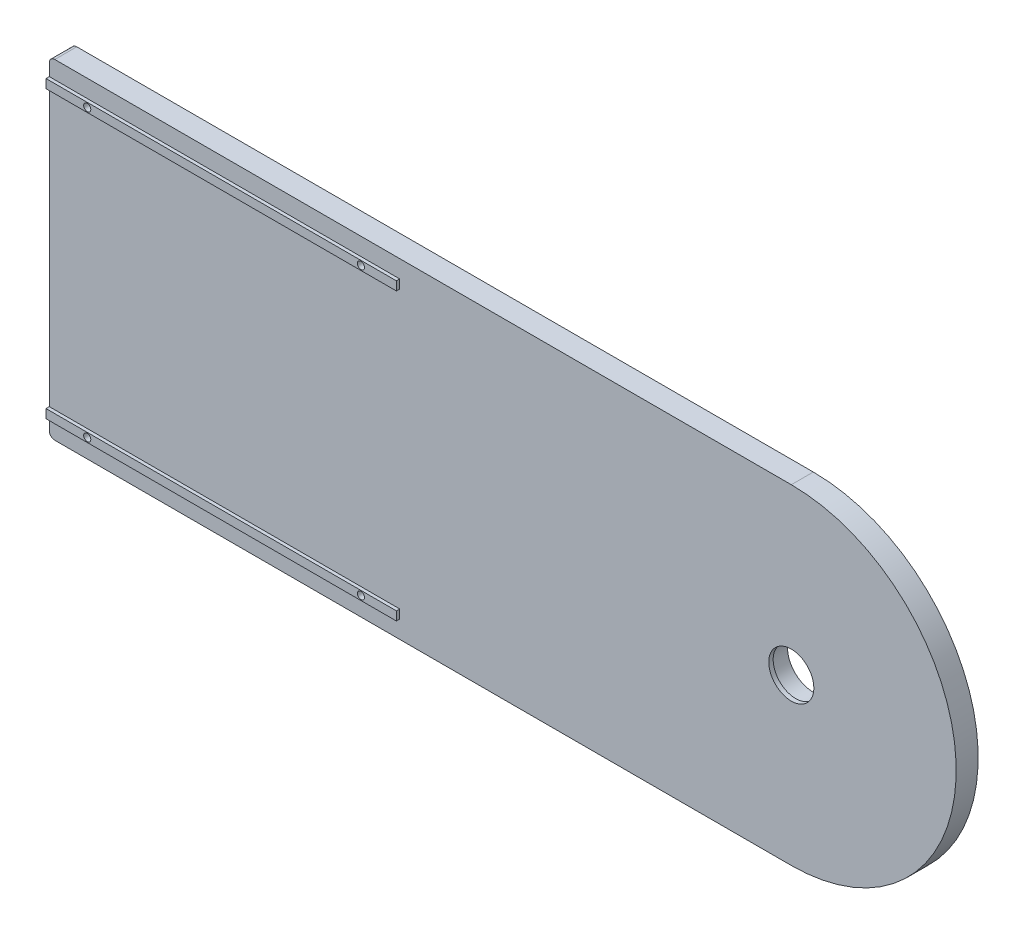
ISO-10303-21;
HEADER;
FILE_DESCRIPTION(('STEP AP214'),'2;1');
FILE_NAME('part.step','',(''),(''),'','','');
FILE_SCHEMA(('AUTOMOTIVE_DESIGN { 1 0 10303 214 1 1 1 1 }'));
ENDSEC;
DATA;
#1=APPLICATION_CONTEXT('core data for automotive mechanical design processes');
#2=APPLICATION_PROTOCOL_DEFINITION('international standard','automotive_design',2000,#1);
#3=PRODUCT_CONTEXT('',#1,'mechanical');
#4=PRODUCT('Part','Part','',(#3));
#5=PRODUCT_RELATED_PRODUCT_CATEGORY('part','',(#4));
#6=PRODUCT_DEFINITION_FORMATION('','',#4);
#7=PRODUCT_DEFINITION_CONTEXT('part definition',#1,'design');
#8=PRODUCT_DEFINITION('design','',#6,#7);
#9=PRODUCT_DEFINITION_SHAPE('','',#8);
#10=(LENGTH_UNIT() NAMED_UNIT(*) SI_UNIT(.MILLI.,.METRE.));
#11=(NAMED_UNIT(*) PLANE_ANGLE_UNIT() SI_UNIT($,.RADIAN.));
#12=(NAMED_UNIT(*) SI_UNIT($,.STERADIAN.) SOLID_ANGLE_UNIT());
#13=UNCERTAINTY_MEASURE_WITH_UNIT(LENGTH_MEASURE(1.E-05),#10,'distance_accuracy_value','');
#14=(GEOMETRIC_REPRESENTATION_CONTEXT(3) GLOBAL_UNCERTAINTY_ASSIGNED_CONTEXT((#13)) GLOBAL_UNIT_ASSIGNED_CONTEXT((#10,
#11,#12)) REPRESENTATION_CONTEXT('',''));
#15=CARTESIAN_POINT('',(0.,0.,0.));
#16=DIRECTION('',(0.,0.,1.));
#17=DIRECTION('',(1.,0.,0.));
#18=AXIS2_PLACEMENT_3D('',#15,#16,#17);
#19=CARTESIAN_POINT('',(-388.5,130.,3.));
#20=DIRECTION('',(0.,0.,-1.));
#21=DIRECTION('',(1.,0.,0.));
#22=AXIS2_PLACEMENT_3D('',#19,#20,#21);
#23=CYLINDRICAL_SURFACE('',#22,3.24999999999995);
#24=CARTESIAN_POINT('',(-388.5,130.,3.));
#25=DIRECTION('',(0.,0.,1.));
#26=DIRECTION('',(1.,0.,0.));
#27=AXIS2_PLACEMENT_3D('',#24,#25,#26);
#28=CIRCLE('',#27,3.24999999999995);
#29=CARTESIAN_POINT('',(-385.25,130.,3.));
#30=VERTEX_POINT('',#29);
#31=EDGE_CURVE('E170',#30,#30,#28,.T.);
#32=ORIENTED_EDGE('',*,*,#31,.T.);
#33=EDGE_LOOP('',(#32));
#34=FACE_BOUND('',#33,.T.);
#35=CARTESIAN_POINT('',(-388.5,130.,-15.5));
#36=DIRECTION('',(0.,0.,1.));
#37=DIRECTION('',(1.,0.,0.));
#38=AXIS2_PLACEMENT_3D('',#35,#36,#37);
#39=CIRCLE('',#38,3.24999999999995);
#40=CARTESIAN_POINT('',(-385.25,130.,-15.5));
#41=VERTEX_POINT('',#40);
#42=EDGE_CURVE('E260',#41,#41,#39,.F.);
#43=ORIENTED_EDGE('',*,*,#42,.T.);
#44=EDGE_LOOP('',(#43));
#45=FACE_BOUND('',#44,.T.);
#46=ADVANCED_FACE('F37',(#34,#45),#23,.F.);
#47=CARTESIAN_POINT('',(-637.5,130.,3.));
#48=DIRECTION('',(0.,0.,-1.));
#49=DIRECTION('',(1.,0.,0.));
#50=AXIS2_PLACEMENT_3D('',#47,#48,#49);
#51=CYLINDRICAL_SURFACE('',#50,3.24999999999995);
#52=CARTESIAN_POINT('',(-637.5,130.,3.));
#53=DIRECTION('',(0.,0.,1.));
#54=DIRECTION('',(1.,0.,0.));
#55=AXIS2_PLACEMENT_3D('',#52,#53,#54);
#56=CIRCLE('',#55,3.24999999999995);
#57=CARTESIAN_POINT('',(-634.25,130.,3.));
#58=VERTEX_POINT('',#57);
#59=EDGE_CURVE('E432',#58,#58,#56,.T.);
#60=ORIENTED_EDGE('',*,*,#59,.T.);
#61=EDGE_LOOP('',(#60));
#62=FACE_BOUND('',#61,.T.);
#63=CARTESIAN_POINT('',(-637.5,130.,-15.5));
#64=DIRECTION('',(0.,0.,1.));
#65=DIRECTION('',(1.,0.,0.));
#66=AXIS2_PLACEMENT_3D('',#63,#64,#65);
#67=CIRCLE('',#66,3.24999999999995);
#68=CARTESIAN_POINT('',(-634.25,130.,-15.5));
#69=VERTEX_POINT('',#68);
#70=EDGE_CURVE('E257',#69,#69,#67,.F.);
#71=ORIENTED_EDGE('',*,*,#70,.T.);
#72=EDGE_LOOP('',(#71));
#73=FACE_BOUND('',#72,.T.);
#74=ADVANCED_FACE('F306',(#62,#73),#51,.F.);
#75=CARTESIAN_POINT('',(-637.5,-130.,3.));
#76=DIRECTION('',(0.,0.,-1.));
#77=DIRECTION('',(1.,0.,0.));
#78=AXIS2_PLACEMENT_3D('',#75,#76,#77);
#79=CYLINDRICAL_SURFACE('',#78,3.24999999999995);
#80=CARTESIAN_POINT('',(-637.5,-130.,3.));
#81=DIRECTION('',(0.,0.,1.));
#82=DIRECTION('',(1.,0.,0.));
#83=AXIS2_PLACEMENT_3D('',#80,#81,#82);
#84=CIRCLE('',#83,3.24999999999995);
#85=CARTESIAN_POINT('',(-634.25,-130.,3.));
#86=VERTEX_POINT('',#85);
#87=EDGE_CURVE('E435',#86,#86,#84,.T.);
#88=ORIENTED_EDGE('',*,*,#87,.T.);
#89=EDGE_LOOP('',(#88));
#90=FACE_BOUND('',#89,.T.);
#91=CARTESIAN_POINT('',(-637.5,-130.,-15.5));
#92=DIRECTION('',(0.,0.,1.));
#93=DIRECTION('',(1.,0.,0.));
#94=AXIS2_PLACEMENT_3D('',#91,#92,#93);
#95=CIRCLE('',#94,3.24999999999995);
#96=CARTESIAN_POINT('',(-634.25,-130.,-15.5));
#97=VERTEX_POINT('',#96);
#98=EDGE_CURVE('E253',#97,#97,#95,.F.);
#99=ORIENTED_EDGE('',*,*,#98,.T.);
#100=EDGE_LOOP('',(#99));
#101=FACE_BOUND('',#100,.T.);
#102=ADVANCED_FACE('F312',(#90,#101),#79,.F.);
#103=CARTESIAN_POINT('',(-388.5,-130.,3.));
#104=DIRECTION('',(0.,0.,-1.));
#105=DIRECTION('',(1.,0.,0.));
#106=AXIS2_PLACEMENT_3D('',#103,#104,#105);
#107=CYLINDRICAL_SURFACE('',#106,3.24999999999995);
#108=CARTESIAN_POINT('',(-388.5,-130.,3.));
#109=DIRECTION('',(0.,0.,1.));
#110=DIRECTION('',(1.,0.,0.));
#111=AXIS2_PLACEMENT_3D('',#108,#109,#110);
#112=CIRCLE('',#111,3.24999999999995);
#113=CARTESIAN_POINT('',(-385.25,-130.,3.));
#114=VERTEX_POINT('',#113);
#115=EDGE_CURVE('E263',#114,#114,#112,.T.);
#116=ORIENTED_EDGE('',*,*,#115,.T.);
#117=EDGE_LOOP('',(#116));
#118=FACE_BOUND('',#117,.T.);
#119=CARTESIAN_POINT('',(-388.5,-130.,-15.5));
#120=DIRECTION('',(0.,0.,1.));
#121=DIRECTION('',(1.,0.,0.));
#122=AXIS2_PLACEMENT_3D('',#119,#120,#121);
#123=CIRCLE('',#122,3.24999999999995);
#124=CARTESIAN_POINT('',(-385.25,-130.,-15.5));
#125=VERTEX_POINT('',#124);
#126=EDGE_CURVE('E250',#125,#125,#123,.F.);
#127=ORIENTED_EDGE('',*,*,#126,.T.);
#128=EDGE_LOOP('',(#127));
#129=FACE_BOUND('',#128,.T.);
#130=ADVANCED_FACE('F319',(#118,#129),#107,.F.);
#131=CARTESIAN_POINT('',(0.,0.,0.));
#132=DIRECTION('',(0.,0.,-1.));
#133=DIRECTION('',(1.,0.,0.));
#134=AXIS2_PLACEMENT_3D('',#131,#132,#133);
#135=PLANE('',#134);
#136=CARTESIAN_POINT('',(0.,0.,0.));
#137=DIRECTION('',(0.,0.,1.));
#138=DIRECTION('',(1.,0.,0.));
#139=AXIS2_PLACEMENT_3D('',#136,#137,#138);
#140=CIRCLE('',#139,20.5);
#141=CARTESIAN_POINT('',(20.5,0.,0.));
#142=VERTEX_POINT('',#141);
#143=EDGE_CURVE('E217',#142,#142,#140,.T.);
#144=ORIENTED_EDGE('',*,*,#143,.F.);
#145=EDGE_LOOP('',(#144));
#146=FACE_BOUND('',#145,.T.);
#147=DIRECTION('',(0.,-1.,0.));
#148=VECTOR('',#147,1.);
#149=CARTESIAN_POINT('',(-675.,150.,0.));
#150=LINE('',#149,#148);
#151=CARTESIAN_POINT('',(-675.,145.,0.));
#152=VERTEX_POINT('',#151);
#153=CARTESIAN_POINT('',(-675.,134.,0.));
#154=VERTEX_POINT('',#153);
#155=EDGE_CURVE('E239',#152,#154,#150,.T.);
#156=ORIENTED_EDGE('',*,*,#155,.T.);
#157=DIRECTION('',(1.,0.,0.));
#158=VECTOR('',#157,1.);
#159=CARTESIAN_POINT('',(-675.,134.,0.));
#160=LINE('',#159,#158);
#161=CARTESIAN_POINT('',(-356.25,134.,0.));
#162=VERTEX_POINT('',#161);
#163=EDGE_CURVE('E153',#154,#162,#160,.T.);
#164=ORIENTED_EDGE('',*,*,#163,.T.);
#165=DIRECTION('',(0.,-1.,0.));
#166=VECTOR('',#165,1.);
#167=CARTESIAN_POINT('',(-356.25,126.,0.));
#168=LINE('',#167,#166);
#169=CARTESIAN_POINT('',(-356.25,126.,0.));
#170=VERTEX_POINT('',#169);
#171=EDGE_CURVE('E167',#162,#170,#168,.T.);
#172=ORIENTED_EDGE('',*,*,#171,.T.);
#173=DIRECTION('',(-1.,0.,0.));
#174=VECTOR('',#173,1.);
#175=CARTESIAN_POINT('',(-675.,126.,0.));
#176=LINE('',#175,#174);
#177=CARTESIAN_POINT('',(-675.,126.,0.));
#178=VERTEX_POINT('',#177);
#179=EDGE_CURVE('E164',#170,#178,#176,.T.);
#180=ORIENTED_EDGE('',*,*,#179,.T.);
#181=CARTESIAN_POINT('',(-675.,-126.,0.));
#182=VERTEX_POINT('',#181);
#183=EDGE_CURVE('E241',#178,#182,#150,.T.);
#184=ORIENTED_EDGE('',*,*,#183,.T.);
#185=DIRECTION('',(1.,0.,0.));
#186=VECTOR('',#185,1.);
#187=CARTESIAN_POINT('',(-675.,-126.,0.));
#188=LINE('',#187,#186);
#189=CARTESIAN_POINT('',(-356.25,-126.,0.));
#190=VERTEX_POINT('',#189);
#191=EDGE_CURVE('E157',#182,#190,#188,.T.);
#192=ORIENTED_EDGE('',*,*,#191,.T.);
#193=DIRECTION('',(0.,-1.,0.));
#194=VECTOR('',#193,1.);
#195=CARTESIAN_POINT('',(-356.25,-134.,0.));
#196=LINE('',#195,#194);
#197=CARTESIAN_POINT('',(-356.25,-134.,0.));
#198=VERTEX_POINT('',#197);
#199=EDGE_CURVE('E198',#190,#198,#196,.T.);
#200=ORIENTED_EDGE('',*,*,#199,.T.);
#201=DIRECTION('',(-1.,0.,0.));
#202=VECTOR('',#201,1.);
#203=CARTESIAN_POINT('',(-675.,-134.,0.));
#204=LINE('',#203,#202);
#205=CARTESIAN_POINT('',(-675.,-134.,0.));
#206=VERTEX_POINT('',#205);
#207=EDGE_CURVE('E187',#198,#206,#204,.T.);
#208=ORIENTED_EDGE('',*,*,#207,.T.);
#209=CARTESIAN_POINT('',(-675.,-145.,0.));
#210=VERTEX_POINT('',#209);
#211=EDGE_CURVE('E238',#206,#210,#150,.T.);
#212=ORIENTED_EDGE('',*,*,#211,.T.);
#213=CARTESIAN_POINT('',(-670.,-145.,0.));
#214=DIRECTION('',(0.,0.,1.));
#215=DIRECTION('',(1.,0.,0.));
#216=AXIS2_PLACEMENT_3D('',#213,#214,#215);
#217=CIRCLE('',#216,5.);
#218=CARTESIAN_POINT('',(-670.,-150.,0.));
#219=VERTEX_POINT('',#218);
#220=EDGE_CURVE('E267',#219,#210,#217,.F.);
#221=ORIENTED_EDGE('',*,*,#220,.F.);
#222=DIRECTION('',(1.,0.,0.));
#223=VECTOR('',#222,1.);
#224=CARTESIAN_POINT('',(-675.,-150.,0.));
#225=LINE('',#224,#223);
#226=CARTESIAN_POINT('',(0.,-150.,0.));
#227=VERTEX_POINT('',#226);
#228=EDGE_CURVE('E225',#219,#227,#225,.T.);
#229=ORIENTED_EDGE('',*,*,#228,.T.);
#230=CARTESIAN_POINT('',(0.,0.,0.));
#231=DIRECTION('',(0.,0.,1.));
#232=DIRECTION('',(1.,0.,0.));
#233=AXIS2_PLACEMENT_3D('',#230,#231,#232);
#234=CIRCLE('',#233,150.);
#235=CARTESIAN_POINT('',(0.,150.,0.));
#236=VERTEX_POINT('',#235);
#237=EDGE_CURVE('E220',#227,#236,#234,.T.);
#238=ORIENTED_EDGE('',*,*,#237,.T.);
#239=DIRECTION('',(-1.,0.,0.));
#240=VECTOR('',#239,1.);
#241=CARTESIAN_POINT('',(0.,150.,0.));
#242=LINE('',#241,#240);
#243=CARTESIAN_POINT('',(-670.,150.,0.));
#244=VERTEX_POINT('',#243);
#245=EDGE_CURVE('E235',#236,#244,#242,.T.);
#246=ORIENTED_EDGE('',*,*,#245,.T.);
#247=CARTESIAN_POINT('',(-670.,145.,0.));
#248=DIRECTION('',(0.,0.,1.));
#249=DIRECTION('',(1.,0.,0.));
#250=AXIS2_PLACEMENT_3D('',#247,#248,#249);
#251=CIRCLE('',#250,5.);
#252=EDGE_CURVE('E270',#152,#244,#251,.F.);
#253=ORIENTED_EDGE('',*,*,#252,.F.);
#254=EDGE_LOOP('',(#156,#164,#172,#180,#184,#192,#200,#208,#212,#221,#229,#238,#246,#253));
#255=FACE_BOUND('',#254,.T.);
#256=ADVANCED_FACE('F284',(#146,#255),#135,.F.);
#257=CARTESIAN_POINT('',(0.,0.,-20.));
#258=DIRECTION('',(0.,0.,1.));
#259=DIRECTION('',(-1.,0.,0.));
#260=AXIS2_PLACEMENT_3D('',#257,#258,#259);
#261=CYLINDRICAL_SURFACE('',#260,20.5);
#262=ORIENTED_EDGE('',*,*,#143,.T.);
#263=EDGE_LOOP('',(#262));
#264=FACE_BOUND('',#263,.T.);
#265=CARTESIAN_POINT('',(0.,0.,-4.));
#266=DIRECTION('',(0.,0.,1.));
#267=DIRECTION('',(1.,0.,0.));
#268=AXIS2_PLACEMENT_3D('',#265,#266,#267);
#269=CIRCLE('',#268,20.5);
#270=CARTESIAN_POINT('',(20.5,0.,-4.));
#271=VERTEX_POINT('',#270);
#272=EDGE_CURVE('E214',#271,#271,#269,.T.);
#273=ORIENTED_EDGE('',*,*,#272,.F.);
#274=EDGE_LOOP('',(#273));
#275=FACE_BOUND('',#274,.T.);
#276=ADVANCED_FACE('F354',(#264,#275),#261,.F.);
#277=CARTESIAN_POINT('',(0.,0.,-20.));
#278=DIRECTION('',(0.,0.,-1.));
#279=DIRECTION('',(1.,0.,0.));
#280=AXIS2_PLACEMENT_3D('',#277,#278,#279);
#281=PLANE('',#280);
#282=CARTESIAN_POINT('',(-637.5,-130.,-20.));
#283=DIRECTION('',(0.,0.,1.));
#284=DIRECTION('',(1.,0.,0.));
#285=AXIS2_PLACEMENT_3D('',#282,#283,#284);
#286=CIRCLE('',#285,5.50000000000007);
#287=CARTESIAN_POINT('',(-632.,-130.,-20.));
#288=VERTEX_POINT('',#287);
#289=EDGE_CURVE('E659',#288,#288,#286,.T.);
#290=ORIENTED_EDGE('',*,*,#289,.T.);
#291=EDGE_LOOP('',(#290));
#292=FACE_BOUND('',#291,.T.);
#293=CARTESIAN_POINT('',(-388.5,-130.,-20.));
#294=DIRECTION('',(0.,0.,1.));
#295=DIRECTION('',(1.,0.,0.));
#296=AXIS2_PLACEMENT_3D('',#293,#294,#295);
#297=CIRCLE('',#296,5.49999999999996);
#298=CARTESIAN_POINT('',(-383.,-130.,-20.));
#299=VERTEX_POINT('',#298);
#300=EDGE_CURVE('E652',#299,#299,#297,.T.);
#301=ORIENTED_EDGE('',*,*,#300,.T.);
#302=EDGE_LOOP('',(#301));
#303=FACE_BOUND('',#302,.T.);
#304=CARTESIAN_POINT('',(-388.5,130.,-20.));
#305=DIRECTION('',(0.,0.,1.));
#306=DIRECTION('',(1.,0.,0.));
#307=AXIS2_PLACEMENT_3D('',#304,#305,#306);
#308=CIRCLE('',#307,5.49999999999996);
#309=CARTESIAN_POINT('',(-383.,130.,-20.));
#310=VERTEX_POINT('',#309);
#311=EDGE_CURVE('E428',#310,#310,#308,.T.);
#312=ORIENTED_EDGE('',*,*,#311,.T.);
#313=EDGE_LOOP('',(#312));
#314=FACE_BOUND('',#313,.T.);
#315=CARTESIAN_POINT('',(-637.5,130.,-20.));
#316=DIRECTION('',(0.,0.,1.));
#317=DIRECTION('',(1.,0.,0.));
#318=AXIS2_PLACEMENT_3D('',#315,#316,#317);
#319=CIRCLE('',#318,5.50000000000007);
#320=CARTESIAN_POINT('',(-632.,130.,-20.));
#321=VERTEX_POINT('',#320);
#322=EDGE_CURVE('E422',#321,#321,#319,.T.);
#323=ORIENTED_EDGE('',*,*,#322,.T.);
#324=EDGE_LOOP('',(#323));
#325=FACE_BOUND('',#324,.T.);
#326=CARTESIAN_POINT('',(0.,0.,-20.));
#327=DIRECTION('',(0.,0.,1.));
#328=DIRECTION('',(1.,0.,0.));
#329=AXIS2_PLACEMENT_3D('',#326,#327,#328);
#330=CIRCLE('',#329,23.5);
#331=CARTESIAN_POINT('',(23.5,0.,-20.));
#332=VERTEX_POINT('',#331);
#333=EDGE_CURVE('E210',#332,#332,#330,.T.);
#334=ORIENTED_EDGE('',*,*,#333,.T.);
#335=EDGE_LOOP('',(#334));
#336=FACE_BOUND('',#335,.T.);
#337=DIRECTION('',(-1.,0.,0.));
#338=VECTOR('',#337,1.);
#339=CARTESIAN_POINT('',(0.,150.,-20.));
#340=LINE('',#339,#338);
#341=CARTESIAN_POINT('',(0.,150.,-20.));
#342=VERTEX_POINT('',#341);
#343=CARTESIAN_POINT('',(-670.,150.,-20.));
#344=VERTEX_POINT('',#343);
#345=EDGE_CURVE('E224',#342,#344,#340,.T.);
#346=ORIENTED_EDGE('',*,*,#345,.F.);
#347=CARTESIAN_POINT('',(0.,0.,-20.));
#348=DIRECTION('',(0.,0.,1.));
#349=DIRECTION('',(1.,0.,0.));
#350=AXIS2_PLACEMENT_3D('',#347,#348,#349);
#351=CIRCLE('',#350,150.);
#352=CARTESIAN_POINT('',(0.,-150.,-20.));
#353=VERTEX_POINT('',#352);
#354=EDGE_CURVE('E221',#353,#342,#351,.T.);
#355=ORIENTED_EDGE('',*,*,#354,.F.);
#356=DIRECTION('',(1.,0.,0.));
#357=VECTOR('',#356,1.);
#358=CARTESIAN_POINT('',(-675.,-150.,-20.));
#359=LINE('',#358,#357);
#360=CARTESIAN_POINT('',(-670.,-150.,-20.));
#361=VERTEX_POINT('',#360);
#362=EDGE_CURVE('E230',#361,#353,#359,.T.);
#363=ORIENTED_EDGE('',*,*,#362,.F.);
#364=CARTESIAN_POINT('',(-670.,-145.,-20.));
#365=DIRECTION('',(0.,0.,1.));
#366=DIRECTION('',(1.,0.,0.));
#367=AXIS2_PLACEMENT_3D('',#364,#365,#366);
#368=CIRCLE('',#367,5.);
#369=CARTESIAN_POINT('',(-675.,-145.,-20.));
#370=VERTEX_POINT('',#369);
#371=EDGE_CURVE('E273',#370,#361,#368,.T.);
#372=ORIENTED_EDGE('',*,*,#371,.F.);
#373=DIRECTION('',(0.,-1.,0.));
#374=VECTOR('',#373,1.);
#375=CARTESIAN_POINT('',(-675.,150.,-20.));
#376=LINE('',#375,#374);
#377=CARTESIAN_POINT('',(-675.,145.,-20.));
#378=VERTEX_POINT('',#377);
#379=EDGE_CURVE('E228',#378,#370,#376,.T.);
#380=ORIENTED_EDGE('',*,*,#379,.F.);
#381=CARTESIAN_POINT('',(-670.,145.,-20.));
#382=DIRECTION('',(0.,0.,1.));
#383=DIRECTION('',(1.,0.,0.));
#384=AXIS2_PLACEMENT_3D('',#381,#382,#383);
#385=CIRCLE('',#384,5.);
#386=EDGE_CURVE('E45',#344,#378,#385,.T.);
#387=ORIENTED_EDGE('',*,*,#386,.F.);
#388=EDGE_LOOP('',(#346,#355,#363,#372,#380,#387));
#389=FACE_BOUND('',#388,.T.);
#390=ADVANCED_FACE('F280',(#292,#303,#314,#325,#336,#389),#281,.T.);
#391=CARTESIAN_POINT('',(0.,0.,-20.));
#392=DIRECTION('',(0.,0.,1.));
#393=DIRECTION('',(-1.,0.,0.));
#394=AXIS2_PLACEMENT_3D('',#391,#392,#393);
#395=CYLINDRICAL_SURFACE('',#394,150.);
#396=ORIENTED_EDGE('',*,*,#237,.F.);
#397=DIRECTION('',(0.,0.,1.));
#398=VECTOR('',#397,1.);
#399=CARTESIAN_POINT('',(0.,-150.,-20.));
#400=LINE('',#399,#398);
#401=EDGE_CURVE('E232',#353,#227,#400,.T.);
#402=ORIENTED_EDGE('',*,*,#401,.F.);
#403=ORIENTED_EDGE('',*,*,#354,.T.);
#404=DIRECTION('',(0.,0.,1.));
#405=VECTOR('',#404,1.);
#406=CARTESIAN_POINT('',(0.,150.,-20.));
#407=LINE('',#406,#405);
#408=EDGE_CURVE('E245',#342,#236,#407,.T.);
#409=ORIENTED_EDGE('',*,*,#408,.T.);
#410=EDGE_LOOP('',(#396,#402,#403,#409));
#411=FACE_BOUND('',#410,.T.);
#412=ADVANCED_FACE('F291',(#411),#395,.T.);
#413=CARTESIAN_POINT('',(0.,150.,-20.));
#414=DIRECTION('',(0.,-1.,0.));
#415=DIRECTION('',(0.,0.,1.));
#416=AXIS2_PLACEMENT_3D('',#413,#414,#415);
#417=PLANE('',#416);
#418=ORIENTED_EDGE('',*,*,#245,.F.);
#419=ORIENTED_EDGE('',*,*,#408,.F.);
#420=ORIENTED_EDGE('',*,*,#345,.T.);
#421=DIRECTION('',(0.,0.,1.));
#422=VECTOR('',#421,1.);
#423=CARTESIAN_POINT('',(-670.,150.,-20.));
#424=LINE('',#423,#422);
#425=EDGE_CURVE('E58',#244,#344,#424,.F.);
#426=ORIENTED_EDGE('',*,*,#425,.F.);
#427=EDGE_LOOP('',(#418,#419,#420,#426));
#428=FACE_BOUND('',#427,.T.);
#429=ADVANCED_FACE('F288',(#428),#417,.F.);
#430=CARTESIAN_POINT('',(-675.,150.,-20.));
#431=DIRECTION('',(1.,0.,0.));
#432=DIRECTION('',(0.,0.,1.));
#433=AXIS2_PLACEMENT_3D('',#430,#431,#432);
#434=PLANE('',#433);
#435=ORIENTED_EDGE('',*,*,#379,.T.);
#436=DIRECTION('',(0.,0.,1.));
#437=VECTOR('',#436,1.);
#438=CARTESIAN_POINT('',(-675.,-145.,-20.));
#439=LINE('',#438,#437);
#440=EDGE_CURVE('E247',#210,#370,#439,.F.);
#441=ORIENTED_EDGE('',*,*,#440,.F.);
#442=ORIENTED_EDGE('',*,*,#211,.F.);
#443=DIRECTION('',(0.,0.,-1.));
#444=VECTOR('',#443,1.);
#445=CARTESIAN_POINT('',(-675.,-134.,3.));
#446=LINE('',#445,#444);
#447=CARTESIAN_POINT('',(-675.,-134.,3.));
#448=VERTEX_POINT('',#447);
#449=EDGE_CURVE('E195',#448,#206,#446,.T.);
#450=ORIENTED_EDGE('',*,*,#449,.F.);
#451=DIRECTION('',(0.,1.,0.));
#452=VECTOR('',#451,1.);
#453=CARTESIAN_POINT('',(-675.,-134.,3.));
#454=LINE('',#453,#452);
#455=CARTESIAN_POINT('',(-675.,-126.,3.));
#456=VERTEX_POINT('',#455);
#457=EDGE_CURVE('E183',#448,#456,#454,.T.);
#458=ORIENTED_EDGE('',*,*,#457,.T.);
#459=DIRECTION('',(0.,0.,-1.));
#460=VECTOR('',#459,1.);
#461=CARTESIAN_POINT('',(-675.,-126.,3.));
#462=LINE('',#461,#460);
#463=EDGE_CURVE('E208',#456,#182,#462,.T.);
#464=ORIENTED_EDGE('',*,*,#463,.T.);
#465=ORIENTED_EDGE('',*,*,#183,.F.);
#466=DIRECTION('',(0.,0.,-1.));
#467=VECTOR('',#466,1.);
#468=CARTESIAN_POINT('',(-675.,126.,3.));
#469=LINE('',#468,#467);
#470=CARTESIAN_POINT('',(-675.,126.,3.));
#471=VERTEX_POINT('',#470);
#472=EDGE_CURVE('E163',#471,#178,#469,.T.);
#473=ORIENTED_EDGE('',*,*,#472,.F.);
#474=DIRECTION('',(0.,1.,0.));
#475=VECTOR('',#474,1.);
#476=CARTESIAN_POINT('',(-675.,126.,3.));
#477=LINE('',#476,#475);
#478=CARTESIAN_POINT('',(-675.,134.,3.));
#479=VERTEX_POINT('',#478);
#480=EDGE_CURVE('E142',#471,#479,#477,.T.);
#481=ORIENTED_EDGE('',*,*,#480,.T.);
#482=DIRECTION('',(0.,0.,-1.));
#483=VECTOR('',#482,1.);
#484=CARTESIAN_POINT('',(-675.,134.,3.));
#485=LINE('',#484,#483);
#486=EDGE_CURVE('E150',#479,#154,#485,.T.);
#487=ORIENTED_EDGE('',*,*,#486,.T.);
#488=ORIENTED_EDGE('',*,*,#155,.F.);
#489=DIRECTION('',(0.,0.,1.));
#490=VECTOR('',#489,1.);
#491=CARTESIAN_POINT('',(-675.,145.,-20.));
#492=LINE('',#491,#490);
#493=EDGE_CURVE('E265',#378,#152,#492,.T.);
#494=ORIENTED_EDGE('',*,*,#493,.F.);
#495=EDGE_LOOP('',(#435,#441,#442,#450,#458,#464,#465,#473,#481,#487,#488,#494));
#496=FACE_BOUND('',#495,.T.);
#497=ADVANCED_FACE('F161',(#496),#434,.F.);
#498=CARTESIAN_POINT('',(-675.,-150.,-20.));
#499=DIRECTION('',(0.,1.,0.));
#500=DIRECTION('',(0.,0.,-1.));
#501=AXIS2_PLACEMENT_3D('',#498,#499,#500);
#502=PLANE('',#501);
#503=ORIENTED_EDGE('',*,*,#362,.T.);
#504=ORIENTED_EDGE('',*,*,#401,.T.);
#505=ORIENTED_EDGE('',*,*,#228,.F.);
#506=DIRECTION('',(0.,0.,1.));
#507=VECTOR('',#506,1.);
#508=CARTESIAN_POINT('',(-670.,-150.,-20.));
#509=LINE('',#508,#507);
#510=EDGE_CURVE('E11',#361,#219,#509,.T.);
#511=ORIENTED_EDGE('',*,*,#510,.F.);
#512=EDGE_LOOP('',(#503,#504,#505,#511));
#513=FACE_BOUND('',#512,.T.);
#514=ADVANCED_FACE('F292',(#513),#502,.F.);
#515=CARTESIAN_POINT('',(0.,0.,-4.));
#516=DIRECTION('',(0.,0.,-1.));
#517=DIRECTION('',(1.,0.,0.));
#518=AXIS2_PLACEMENT_3D('',#515,#516,#517);
#519=CYLINDRICAL_SURFACE('',#518,23.5);
#520=CARTESIAN_POINT('',(0.,0.,-4.));
#521=DIRECTION('',(0.,0.,1.));
#522=DIRECTION('',(1.,0.,0.));
#523=AXIS2_PLACEMENT_3D('',#520,#521,#522);
#524=CIRCLE('',#523,23.5);
#525=CARTESIAN_POINT('',(23.5,0.,-4.));
#526=VERTEX_POINT('',#525);
#527=EDGE_CURVE('E211',#526,#526,#524,.T.);
#528=ORIENTED_EDGE('',*,*,#527,.T.);
#529=EDGE_LOOP('',(#528));
#530=FACE_BOUND('',#529,.T.);
#531=ORIENTED_EDGE('',*,*,#333,.F.);
#532=EDGE_LOOP('',(#531));
#533=FACE_BOUND('',#532,.T.);
#534=ADVANCED_FACE('F294',(#530,#533),#519,.F.);
#535=CARTESIAN_POINT('',(0.,0.,-4.));
#536=DIRECTION('',(0.,0.,-1.));
#537=DIRECTION('',(1.,0.,0.));
#538=AXIS2_PLACEMENT_3D('',#535,#536,#537);
#539=PLANE('',#538);
#540=ORIENTED_EDGE('',*,*,#272,.T.);
#541=EDGE_LOOP('',(#540));
#542=FACE_BOUND('',#541,.T.);
#543=ORIENTED_EDGE('',*,*,#527,.F.);
#544=EDGE_LOOP('',(#543));
#545=FACE_BOUND('',#544,.T.);
#546=ADVANCED_FACE('F300',(#542,#545),#539,.T.);
#547=CARTESIAN_POINT('',(-675.,-126.,3.));
#548=DIRECTION('',(0.,-1.,0.));
#549=DIRECTION('',(0.,0.,1.));
#550=AXIS2_PLACEMENT_3D('',#547,#548,#549);
#551=PLANE('',#550);
#552=ORIENTED_EDGE('',*,*,#191,.F.);
#553=ORIENTED_EDGE('',*,*,#463,.F.);
#554=DIRECTION('',(1.,0.,0.));
#555=VECTOR('',#554,1.);
#556=CARTESIAN_POINT('',(-675.,-126.,3.));
#557=LINE('',#556,#555);
#558=CARTESIAN_POINT('',(-356.25,-126.,3.));
#559=VERTEX_POINT('',#558);
#560=EDGE_CURVE('E186',#456,#559,#557,.T.);
#561=ORIENTED_EDGE('',*,*,#560,.T.);
#562=DIRECTION('',(0.,0.,-1.));
#563=VECTOR('',#562,1.);
#564=CARTESIAN_POINT('',(-356.25,-126.,3.));
#565=LINE('',#564,#563);
#566=EDGE_CURVE('E206',#559,#190,#565,.T.);
#567=ORIENTED_EDGE('',*,*,#566,.T.);
#568=EDGE_LOOP('',(#552,#553,#561,#567));
#569=FACE_BOUND('',#568,.T.);
#570=ADVANCED_FACE('F346',(#569),#551,.F.);
#571=CARTESIAN_POINT('',(-356.25,-134.,3.));
#572=DIRECTION('',(-1.,0.,0.));
#573=DIRECTION('',(0.,0.,-1.));
#574=AXIS2_PLACEMENT_3D('',#571,#572,#573);
#575=PLANE('',#574);
#576=ORIENTED_EDGE('',*,*,#199,.F.);
#577=ORIENTED_EDGE('',*,*,#566,.F.);
#578=DIRECTION('',(0.,-1.,0.));
#579=VECTOR('',#578,1.);
#580=CARTESIAN_POINT('',(-356.25,-134.,3.));
#581=LINE('',#580,#579);
#582=CARTESIAN_POINT('',(-356.25,-134.,3.));
#583=VERTEX_POINT('',#582);
#584=EDGE_CURVE('E190',#559,#583,#581,.T.);
#585=ORIENTED_EDGE('',*,*,#584,.T.);
#586=DIRECTION('',(0.,0.,-1.));
#587=VECTOR('',#586,1.);
#588=CARTESIAN_POINT('',(-356.25,-134.,3.));
#589=LINE('',#588,#587);
#590=EDGE_CURVE('E204',#583,#198,#589,.T.);
#591=ORIENTED_EDGE('',*,*,#590,.T.);
#592=EDGE_LOOP('',(#576,#577,#585,#591));
#593=FACE_BOUND('',#592,.T.);
#594=ADVANCED_FACE('F342',(#593),#575,.F.);
#595=CARTESIAN_POINT('',(-675.,-134.,3.));
#596=DIRECTION('',(0.,1.,0.));
#597=DIRECTION('',(-1.,0.,0.));
#598=AXIS2_PLACEMENT_3D('',#595,#596,#597);
#599=PLANE('',#598);
#600=ORIENTED_EDGE('',*,*,#207,.F.);
#601=ORIENTED_EDGE('',*,*,#590,.F.);
#602=DIRECTION('',(-1.,0.,0.));
#603=VECTOR('',#602,1.);
#604=CARTESIAN_POINT('',(-675.,-134.,3.));
#605=LINE('',#604,#603);
#606=EDGE_CURVE('E193',#583,#448,#605,.T.);
#607=ORIENTED_EDGE('',*,*,#606,.T.);
#608=ORIENTED_EDGE('',*,*,#449,.T.);
#609=EDGE_LOOP('',(#600,#601,#607,#608));
#610=FACE_BOUND('',#609,.T.);
#611=ADVANCED_FACE('F338',(#610),#599,.F.);
#612=CARTESIAN_POINT('',(0.,0.,3.));
#613=DIRECTION('',(0.,0.,1.));
#614=DIRECTION('',(-1.,0.,0.));
#615=AXIS2_PLACEMENT_3D('',#612,#613,#614);
#616=PLANE('',#615);
#617=ORIENTED_EDGE('',*,*,#115,.F.);
#618=EDGE_LOOP('',(#617));
#619=FACE_BOUND('',#618,.T.);
#620=ORIENTED_EDGE('',*,*,#87,.F.);
#621=EDGE_LOOP('',(#620));
#622=FACE_BOUND('',#621,.T.);
#623=ORIENTED_EDGE('',*,*,#457,.F.);
#624=ORIENTED_EDGE('',*,*,#606,.F.);
#625=ORIENTED_EDGE('',*,*,#584,.F.);
#626=ORIENTED_EDGE('',*,*,#560,.F.);
#627=EDGE_LOOP('',(#623,#624,#625,#626));
#628=FACE_BOUND('',#627,.T.);
#629=ADVANCED_FACE('F335',(#619,#622,#628),#616,.T.);
#630=CARTESIAN_POINT('',(-675.,134.,3.));
#631=DIRECTION('',(0.,-1.,0.));
#632=DIRECTION('',(1.,0.,0.));
#633=AXIS2_PLACEMENT_3D('',#630,#631,#632);
#634=PLANE('',#633);
#635=ORIENTED_EDGE('',*,*,#163,.F.);
#636=ORIENTED_EDGE('',*,*,#486,.F.);
#637=DIRECTION('',(1.,0.,0.));
#638=VECTOR('',#637,1.);
#639=CARTESIAN_POINT('',(-675.,134.,3.));
#640=LINE('',#639,#638);
#641=CARTESIAN_POINT('',(-356.25,134.,3.));
#642=VERTEX_POINT('',#641);
#643=EDGE_CURVE('E138',#479,#642,#640,.T.);
#644=ORIENTED_EDGE('',*,*,#643,.T.);
#645=DIRECTION('',(0.,0.,-1.));
#646=VECTOR('',#645,1.);
#647=CARTESIAN_POINT('',(-356.25,134.,3.));
#648=LINE('',#647,#646);
#649=EDGE_CURVE('E158',#642,#162,#648,.T.);
#650=ORIENTED_EDGE('',*,*,#649,.T.);
#651=EDGE_LOOP('',(#635,#636,#644,#650));
#652=FACE_BOUND('',#651,.T.);
#653=ADVANCED_FACE('F151',(#652),#634,.F.);
#654=CARTESIAN_POINT('',(-356.25,126.,3.));
#655=DIRECTION('',(-1.,0.,0.));
#656=DIRECTION('',(0.,0.,-1.));
#657=AXIS2_PLACEMENT_3D('',#654,#655,#656);
#658=PLANE('',#657);
#659=ORIENTED_EDGE('',*,*,#171,.F.);
#660=ORIENTED_EDGE('',*,*,#649,.F.);
#661=DIRECTION('',(0.,-1.,0.));
#662=VECTOR('',#661,1.);
#663=CARTESIAN_POINT('',(-356.25,126.,3.));
#664=LINE('',#663,#662);
#665=CARTESIAN_POINT('',(-356.25,126.,3.));
#666=VERTEX_POINT('',#665);
#667=EDGE_CURVE('E145',#642,#666,#664,.T.);
#668=ORIENTED_EDGE('',*,*,#667,.T.);
#669=DIRECTION('',(0.,0.,-1.));
#670=VECTOR('',#669,1.);
#671=CARTESIAN_POINT('',(-356.25,126.,3.));
#672=LINE('',#671,#670);
#673=EDGE_CURVE('E180',#666,#170,#672,.T.);
#674=ORIENTED_EDGE('',*,*,#673,.T.);
#675=EDGE_LOOP('',(#659,#660,#668,#674));
#676=FACE_BOUND('',#675,.T.);
#677=ADVANCED_FACE('F328',(#676),#658,.F.);
#678=CARTESIAN_POINT('',(-675.,126.,3.));
#679=DIRECTION('',(0.,1.,0.));
#680=DIRECTION('',(-1.,0.,0.));
#681=AXIS2_PLACEMENT_3D('',#678,#679,#680);
#682=PLANE('',#681);
#683=ORIENTED_EDGE('',*,*,#179,.F.);
#684=ORIENTED_EDGE('',*,*,#673,.F.);
#685=DIRECTION('',(-1.,0.,0.));
#686=VECTOR('',#685,1.);
#687=CARTESIAN_POINT('',(-675.,126.,3.));
#688=LINE('',#687,#686);
#689=EDGE_CURVE('E174',#666,#471,#688,.T.);
#690=ORIENTED_EDGE('',*,*,#689,.T.);
#691=ORIENTED_EDGE('',*,*,#472,.T.);
#692=EDGE_LOOP('',(#683,#684,#690,#691));
#693=FACE_BOUND('',#692,.T.);
#694=ADVANCED_FACE('F324',(#693),#682,.F.);
#695=CARTESIAN_POINT('',(0.,0.,3.));
#696=DIRECTION('',(0.,0.,1.));
#697=DIRECTION('',(-1.,0.,0.));
#698=AXIS2_PLACEMENT_3D('',#695,#696,#697);
#699=PLANE('',#698);
#700=ORIENTED_EDGE('',*,*,#59,.F.);
#701=EDGE_LOOP('',(#700));
#702=FACE_BOUND('',#701,.T.);
#703=ORIENTED_EDGE('',*,*,#31,.F.);
#704=EDGE_LOOP('',(#703));
#705=FACE_BOUND('',#704,.T.);
#706=ORIENTED_EDGE('',*,*,#480,.F.);
#707=ORIENTED_EDGE('',*,*,#689,.F.);
#708=ORIENTED_EDGE('',*,*,#667,.F.);
#709=ORIENTED_EDGE('',*,*,#643,.F.);
#710=EDGE_LOOP('',(#706,#707,#708,#709));
#711=FACE_BOUND('',#710,.T.);
#712=ADVANCED_FACE('F140',(#702,#705,#711),#699,.T.);
#713=CARTESIAN_POINT('',(-388.5,-130.,-15.5));
#714=DIRECTION('',(0.,0.,-1.));
#715=DIRECTION('',(1.,0.,0.));
#716=AXIS2_PLACEMENT_3D('',#713,#714,#715);
#717=PLANE('',#716);
#718=CARTESIAN_POINT('',(-388.5,-130.,-15.5));
#719=DIRECTION('',(0.,0.,1.));
#720=DIRECTION('',(1.,0.,0.));
#721=AXIS2_PLACEMENT_3D('',#718,#719,#720);
#722=CIRCLE('',#721,5.49999999999996);
#723=CARTESIAN_POINT('',(-383.,-130.,-15.5));
#724=VERTEX_POINT('',#723);
#725=EDGE_CURVE('E649',#724,#724,#722,.T.);
#726=ORIENTED_EDGE('',*,*,#725,.F.);
#727=EDGE_LOOP('',(#726));
#728=FACE_BOUND('',#727,.T.);
#729=ORIENTED_EDGE('',*,*,#126,.F.);
#730=EDGE_LOOP('',(#729));
#731=FACE_BOUND('',#730,.T.);
#732=ADVANCED_FACE('F323',(#728,#731),#717,.T.);
#733=CARTESIAN_POINT('',(-388.5,-130.,-15.5));
#734=DIRECTION('',(0.,0.,-1.));
#735=DIRECTION('',(1.,0.,0.));
#736=AXIS2_PLACEMENT_3D('',#733,#734,#735);
#737=CYLINDRICAL_SURFACE('',#736,5.49999999999996);
#738=ORIENTED_EDGE('',*,*,#725,.T.);
#739=EDGE_LOOP('',(#738));
#740=FACE_BOUND('',#739,.T.);
#741=ORIENTED_EDGE('',*,*,#300,.F.);
#742=EDGE_LOOP('',(#741));
#743=FACE_BOUND('',#742,.T.);
#744=ADVANCED_FACE('F384',(#740,#743),#737,.F.);
#745=CARTESIAN_POINT('',(-637.5,-130.,-15.5));
#746=DIRECTION('',(0.,0.,-1.));
#747=DIRECTION('',(1.,0.,0.));
#748=AXIS2_PLACEMENT_3D('',#745,#746,#747);
#749=PLANE('',#748);
#750=CARTESIAN_POINT('',(-637.5,-130.,-15.5));
#751=DIRECTION('',(0.,0.,1.));
#752=DIRECTION('',(1.,0.,0.));
#753=AXIS2_PLACEMENT_3D('',#750,#751,#752);
#754=CIRCLE('',#753,5.50000000000007);
#755=CARTESIAN_POINT('',(-632.,-130.,-15.5));
#756=VERTEX_POINT('',#755);
#757=EDGE_CURVE('E657',#756,#756,#754,.T.);
#758=ORIENTED_EDGE('',*,*,#757,.F.);
#759=EDGE_LOOP('',(#758));
#760=FACE_BOUND('',#759,.T.);
#761=ORIENTED_EDGE('',*,*,#98,.F.);
#762=EDGE_LOOP('',(#761));
#763=FACE_BOUND('',#762,.T.);
#764=ADVANCED_FACE('F390',(#760,#763),#749,.T.);
#765=CARTESIAN_POINT('',(-637.5,-130.,-15.5));
#766=DIRECTION('',(0.,0.,-1.));
#767=DIRECTION('',(1.,0.,0.));
#768=AXIS2_PLACEMENT_3D('',#765,#766,#767);
#769=CYLINDRICAL_SURFACE('',#768,5.50000000000007);
#770=ORIENTED_EDGE('',*,*,#757,.T.);
#771=EDGE_LOOP('',(#770));
#772=FACE_BOUND('',#771,.T.);
#773=ORIENTED_EDGE('',*,*,#289,.F.);
#774=EDGE_LOOP('',(#773));
#775=FACE_BOUND('',#774,.T.);
#776=ADVANCED_FACE('F400',(#772,#775),#769,.F.);
#777=CARTESIAN_POINT('',(-637.5,130.,-15.5));
#778=DIRECTION('',(0.,0.,-1.));
#779=DIRECTION('',(1.,0.,0.));
#780=AXIS2_PLACEMENT_3D('',#777,#778,#779);
#781=PLANE('',#780);
#782=CARTESIAN_POINT('',(-637.5,130.,-15.5));
#783=DIRECTION('',(0.,0.,1.));
#784=DIRECTION('',(1.,0.,0.));
#785=AXIS2_PLACEMENT_3D('',#782,#783,#784);
#786=CIRCLE('',#785,5.50000000000007);
#787=CARTESIAN_POINT('',(-632.,130.,-15.5));
#788=VERTEX_POINT('',#787);
#789=EDGE_CURVE('E254',#788,#788,#786,.T.);
#790=ORIENTED_EDGE('',*,*,#789,.F.);
#791=EDGE_LOOP('',(#790));
#792=FACE_BOUND('',#791,.T.);
#793=ORIENTED_EDGE('',*,*,#70,.F.);
#794=EDGE_LOOP('',(#793));
#795=FACE_BOUND('',#794,.T.);
#796=ADVANCED_FACE('F404',(#792,#795),#781,.T.);
#797=CARTESIAN_POINT('',(-637.5,130.,-15.5));
#798=DIRECTION('',(0.,0.,-1.));
#799=DIRECTION('',(1.,0.,0.));
#800=AXIS2_PLACEMENT_3D('',#797,#798,#799);
#801=CYLINDRICAL_SURFACE('',#800,5.50000000000007);
#802=ORIENTED_EDGE('',*,*,#789,.T.);
#803=EDGE_LOOP('',(#802));
#804=FACE_BOUND('',#803,.T.);
#805=ORIENTED_EDGE('',*,*,#322,.F.);
#806=EDGE_LOOP('',(#805));
#807=FACE_BOUND('',#806,.T.);
#808=ADVANCED_FACE('F408',(#804,#807),#801,.F.);
#809=CARTESIAN_POINT('',(-388.5,130.,-15.5));
#810=DIRECTION('',(0.,0.,-1.));
#811=DIRECTION('',(1.,0.,0.));
#812=AXIS2_PLACEMENT_3D('',#809,#810,#811);
#813=PLANE('',#812);
#814=CARTESIAN_POINT('',(-388.5,130.,-15.5));
#815=DIRECTION('',(0.,0.,1.));
#816=DIRECTION('',(1.,0.,0.));
#817=AXIS2_PLACEMENT_3D('',#814,#815,#816);
#818=CIRCLE('',#817,5.49999999999996);
#819=CARTESIAN_POINT('',(-383.,130.,-15.5));
#820=VERTEX_POINT('',#819);
#821=EDGE_CURVE('E424',#820,#820,#818,.T.);
#822=ORIENTED_EDGE('',*,*,#821,.F.);
#823=EDGE_LOOP('',(#822));
#824=FACE_BOUND('',#823,.T.);
#825=ORIENTED_EDGE('',*,*,#42,.F.);
#826=EDGE_LOOP('',(#825));
#827=FACE_BOUND('',#826,.T.);
#828=ADVANCED_FACE('F411',(#824,#827),#813,.T.);
#829=CARTESIAN_POINT('',(-388.5,130.,-15.5));
#830=DIRECTION('',(0.,0.,-1.));
#831=DIRECTION('',(1.,0.,0.));
#832=AXIS2_PLACEMENT_3D('',#829,#830,#831);
#833=CYLINDRICAL_SURFACE('',#832,5.49999999999996);
#834=ORIENTED_EDGE('',*,*,#821,.T.);
#835=EDGE_LOOP('',(#834));
#836=FACE_BOUND('',#835,.T.);
#837=ORIENTED_EDGE('',*,*,#311,.F.);
#838=EDGE_LOOP('',(#837));
#839=FACE_BOUND('',#838,.T.);
#840=ADVANCED_FACE('F395',(#836,#839),#833,.F.);
#841=CARTESIAN_POINT('',(-670.,145.,-20.));
#842=DIRECTION('',(0.,0.,1.));
#843=DIRECTION('',(-1.,0.,0.));
#844=AXIS2_PLACEMENT_3D('',#841,#842,#843);
#845=CYLINDRICAL_SURFACE('',#844,5.);
#846=ORIENTED_EDGE('',*,*,#386,.T.);
#847=ORIENTED_EDGE('',*,*,#493,.T.);
#848=ORIENTED_EDGE('',*,*,#252,.T.);
#849=ORIENTED_EDGE('',*,*,#425,.T.);
#850=EDGE_LOOP('',(#846,#847,#848,#849));
#851=FACE_BOUND('',#850,.T.);
#852=ADVANCED_FACE('F275',(#851),#845,.T.);
#853=CARTESIAN_POINT('',(-670.,-145.,-20.));
#854=DIRECTION('',(0.,0.,1.));
#855=DIRECTION('',(-1.,0.,0.));
#856=AXIS2_PLACEMENT_3D('',#853,#854,#855);
#857=CYLINDRICAL_SURFACE('',#856,5.);
#858=ORIENTED_EDGE('',*,*,#371,.T.);
#859=ORIENTED_EDGE('',*,*,#510,.T.);
#860=ORIENTED_EDGE('',*,*,#220,.T.);
#861=ORIENTED_EDGE('',*,*,#440,.T.);
#862=EDGE_LOOP('',(#858,#859,#860,#861));
#863=FACE_BOUND('',#862,.T.);
#864=ADVANCED_FACE('F39',(#863),#857,.T.);
#865=CLOSED_SHELL('',(#46,#74,#102,#130,#256,#276,#390,#412,#429,#497,#514,#534,#546,#570,#594,
#611,#629,#653,#677,#694,#712,#732,#744,#764,#776,#796,#808,#828,#840,#852,#864));
#866=MANIFOLD_SOLID_BREP('B2',#865);
#867=ADVANCED_BREP_SHAPE_REPRESENTATION('',(#18,#866),#14);
#868=SHAPE_DEFINITION_REPRESENTATION(#9,#867);
ENDSEC;
END-ISO-10303-21;
